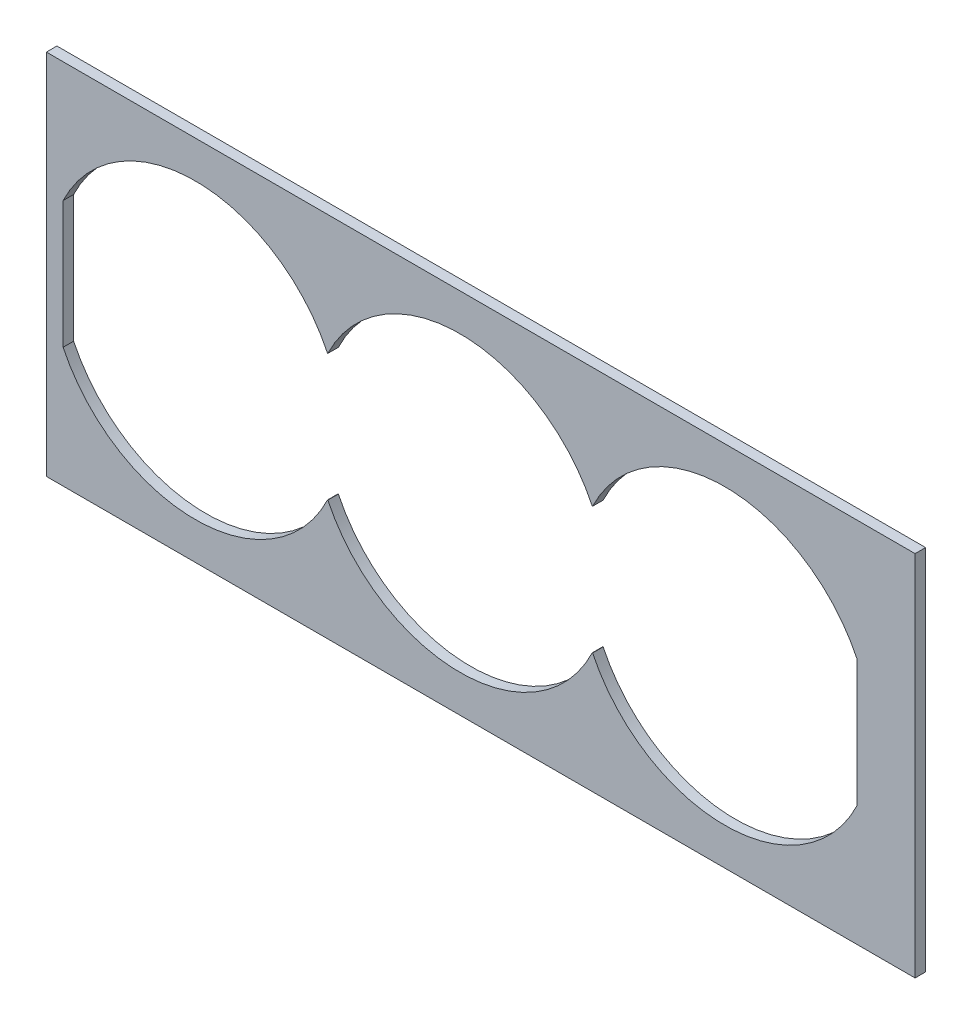
ISO-10303-21;
HEADER;
FILE_DESCRIPTION(('STEP AP214'),'2;1');
FILE_NAME('part.step','',(''),(''),'','','');
FILE_SCHEMA(('AUTOMOTIVE_DESIGN { 1 0 10303 214 1 1 1 1 }'));
ENDSEC;
DATA;
#1=APPLICATION_CONTEXT('core data for automotive mechanical design processes');
#2=APPLICATION_PROTOCOL_DEFINITION('international standard','automotive_design',2000,#1);
#3=PRODUCT_CONTEXT('',#1,'mechanical');
#4=PRODUCT('Part','Part','',(#3));
#5=PRODUCT_RELATED_PRODUCT_CATEGORY('part','',(#4));
#6=PRODUCT_DEFINITION_FORMATION('','',#4);
#7=PRODUCT_DEFINITION_CONTEXT('part definition',#1,'design');
#8=PRODUCT_DEFINITION('design','',#6,#7);
#9=PRODUCT_DEFINITION_SHAPE('','',#8);
#10=(LENGTH_UNIT() NAMED_UNIT(*) SI_UNIT(.MILLI.,.METRE.));
#11=(NAMED_UNIT(*) PLANE_ANGLE_UNIT() SI_UNIT($,.RADIAN.));
#12=(NAMED_UNIT(*) SI_UNIT($,.STERADIAN.) SOLID_ANGLE_UNIT());
#13=UNCERTAINTY_MEASURE_WITH_UNIT(LENGTH_MEASURE(1.E-05),#10,'distance_accuracy_value','');
#14=(GEOMETRIC_REPRESENTATION_CONTEXT(3) GLOBAL_UNCERTAINTY_ASSIGNED_CONTEXT((#13)) GLOBAL_UNIT_ASSIGNED_CONTEXT((#10,
#11,#12)) REPRESENTATION_CONTEXT('',''));
#15=CARTESIAN_POINT('',(0.,0.,0.));
#16=DIRECTION('',(0.,0.,1.));
#17=DIRECTION('',(1.,0.,0.));
#18=AXIS2_PLACEMENT_3D('',#15,#16,#17);
#19=CARTESIAN_POINT('',(0.,0.,4.));
#20=DIRECTION('',(0.,0.,-1.));
#21=DIRECTION('',(-1.,0.,0.));
#22=AXIS2_PLACEMENT_3D('',#19,#20,#21);
#23=PLANE('',#22);
#24=DIRECTION('',(0.,1.,0.));
#25=VECTOR('',#24,1.);
#26=CARTESIAN_POINT('',(330.2,0.,4.));
#27=LINE('',#26,#25);
#28=CARTESIAN_POINT('',(330.2,0.,4.));
#29=VERTEX_POINT('',#28);
#30=CARTESIAN_POINT('',(330.2,139.7,4.));
#31=VERTEX_POINT('',#30);
#32=EDGE_CURVE('E243',#29,#31,#27,.T.);
#33=ORIENTED_EDGE('',*,*,#32,.T.);
#34=DIRECTION('',(-1.,0.,0.));
#35=VECTOR('',#34,1.);
#36=CARTESIAN_POINT('',(0.,139.7,4.));
#37=LINE('',#36,#35);
#38=CARTESIAN_POINT('',(0.,139.7,4.));
#39=VERTEX_POINT('',#38);
#40=EDGE_CURVE('E246',#31,#39,#37,.T.);
#41=ORIENTED_EDGE('',*,*,#40,.T.);
#42=DIRECTION('',(0.,-1.,0.));
#43=VECTOR('',#42,1.);
#44=CARTESIAN_POINT('',(0.,0.,4.));
#45=LINE('',#44,#43);
#46=CARTESIAN_POINT('',(0.,0.,4.));
#47=VERTEX_POINT('',#46);
#48=EDGE_CURVE('E249',#39,#47,#45,.T.);
#49=ORIENTED_EDGE('',*,*,#48,.T.);
#50=DIRECTION('',(1.,0.,0.));
#51=VECTOR('',#50,1.);
#52=CARTESIAN_POINT('',(0.,0.,4.));
#53=LINE('',#52,#51);
#54=EDGE_CURVE('E251',#47,#29,#53,.T.);
#55=ORIENTED_EDGE('',*,*,#54,.T.);
#56=EDGE_LOOP('',(#33,#41,#49,#55));
#57=FACE_BOUND('',#56,.T.);
#58=CARTESIAN_POINT('',(56.604,69.8499999999999,4.));
#59=DIRECTION('',(0.,0.,1.));
#60=DIRECTION('',(1.,0.,0.));
#61=AXIS2_PLACEMENT_3D('',#58,#59,#60);
#62=CIRCLE('',#61,55.754);
#63=CARTESIAN_POINT('',(106.858,93.9963040650116,4.));
#64=VERTEX_POINT('',#63);
#65=CARTESIAN_POINT('',(6.35,93.9963040650116,4.));
#66=VERTEX_POINT('',#65);
#67=EDGE_CURVE('E150',#64,#66,#62,.T.);
#68=ORIENTED_EDGE('',*,*,#67,.F.);
#69=DIRECTION('',(-1.,0.,0.));
#70=VECTOR('',#69,1.);
#71=CARTESIAN_POINT('',(106.858,93.9963040650116,4.));
#72=LINE('',#71,#70);
#73=CARTESIAN_POINT('',(106.985,93.9963040650116,4.));
#74=VERTEX_POINT('',#73);
#75=EDGE_CURVE('E191',#74,#64,#72,.T.);
#76=ORIENTED_EDGE('',*,*,#75,.F.);
#77=CARTESIAN_POINT('',(157.239,69.8499999999999,4.));
#78=DIRECTION('',(0.,0.,1.));
#79=DIRECTION('',(1.,0.,0.));
#80=AXIS2_PLACEMENT_3D('',#77,#78,#79);
#81=CIRCLE('',#80,55.754);
#82=CARTESIAN_POINT('',(207.493,93.9963040650116,4.));
#83=VERTEX_POINT('',#82);
#84=EDGE_CURVE('E189',#83,#74,#81,.T.);
#85=ORIENTED_EDGE('',*,*,#84,.F.);
#86=DIRECTION('',(-1.,0.,0.));
#87=VECTOR('',#86,1.);
#88=CARTESIAN_POINT('',(207.493,93.9963040650116,4.));
#89=LINE('',#88,#87);
#90=CARTESIAN_POINT('',(207.62,93.9963040650116,4.));
#91=VERTEX_POINT('',#90);
#92=EDGE_CURVE('E187',#91,#83,#89,.T.);
#93=ORIENTED_EDGE('',*,*,#92,.F.);
#94=CARTESIAN_POINT('',(257.874,69.8499999999999,4.));
#95=DIRECTION('',(0.,0.,1.));
#96=DIRECTION('',(1.,0.,0.));
#97=AXIS2_PLACEMENT_3D('',#94,#95,#96);
#98=CIRCLE('',#97,55.754);
#99=CARTESIAN_POINT('',(308.128,93.9963040650116,4.));
#100=VERTEX_POINT('',#99);
#101=EDGE_CURVE('E185',#100,#91,#98,.T.);
#102=ORIENTED_EDGE('',*,*,#101,.F.);
#103=DIRECTION('',(0.,1.,0.));
#104=VECTOR('',#103,1.);
#105=CARTESIAN_POINT('',(308.128,93.9963040650116,4.));
#106=LINE('',#105,#104);
#107=CARTESIAN_POINT('',(308.128,45.7036959349883,4.));
#108=VERTEX_POINT('',#107);
#109=EDGE_CURVE('E183',#108,#100,#106,.T.);
#110=ORIENTED_EDGE('',*,*,#109,.F.);
#111=CARTESIAN_POINT('',(257.874,69.8499999999999,4.));
#112=DIRECTION('',(0.,0.,1.));
#113=DIRECTION('',(1.,0.,0.));
#114=AXIS2_PLACEMENT_3D('',#111,#112,#113);
#115=CIRCLE('',#114,55.754);
#116=CARTESIAN_POINT('',(207.62,45.7036959349884,4.));
#117=VERTEX_POINT('',#116);
#118=EDGE_CURVE('E181',#117,#108,#115,.T.);
#119=ORIENTED_EDGE('',*,*,#118,.F.);
#120=DIRECTION('',(1.,8.74191357973027E-13,0.));
#121=VECTOR('',#120,1.);
#122=CARTESIAN_POINT('',(207.62,45.7036959349884,4.));
#123=LINE('',#122,#121);
#124=CARTESIAN_POINT('',(207.493,45.7036959349883,4.));
#125=VERTEX_POINT('',#124);
#126=EDGE_CURVE('E179',#125,#117,#123,.T.);
#127=ORIENTED_EDGE('',*,*,#126,.F.);
#128=CARTESIAN_POINT('',(157.239,69.8499999999999,4.));
#129=DIRECTION('',(0.,0.,1.));
#130=DIRECTION('',(1.,0.,0.));
#131=AXIS2_PLACEMENT_3D('',#128,#129,#130);
#132=CIRCLE('',#131,55.754);
#133=CARTESIAN_POINT('',(106.985,45.7036959349884,4.));
#134=VERTEX_POINT('',#133);
#135=EDGE_CURVE('E177',#134,#125,#132,.T.);
#136=ORIENTED_EDGE('',*,*,#135,.F.);
#137=DIRECTION('',(1.,8.74191357973027E-13,0.));
#138=VECTOR('',#137,1.);
#139=CARTESIAN_POINT('',(106.985,45.7036959349884,4.));
#140=LINE('',#139,#138);
#141=CARTESIAN_POINT('',(106.858,45.7036959349883,4.));
#142=VERTEX_POINT('',#141);
#143=EDGE_CURVE('E173',#142,#134,#140,.T.);
#144=ORIENTED_EDGE('',*,*,#143,.F.);
#145=CARTESIAN_POINT('',(56.604,69.8499999999999,4.));
#146=DIRECTION('',(0.,0.,1.));
#147=DIRECTION('',(1.,0.,0.));
#148=AXIS2_PLACEMENT_3D('',#145,#146,#147);
#149=CIRCLE('',#148,55.754);
#150=CARTESIAN_POINT('',(6.35,45.7036959349884,4.));
#151=VERTEX_POINT('',#150);
#152=EDGE_CURVE('E171',#151,#142,#149,.T.);
#153=ORIENTED_EDGE('',*,*,#152,.F.);
#154=DIRECTION('',(0.,-1.,0.));
#155=VECTOR('',#154,1.);
#156=CARTESIAN_POINT('',(6.35,93.9963040650116,4.));
#157=LINE('',#156,#155);
#158=EDGE_CURVE('E158',#66,#151,#157,.T.);
#159=ORIENTED_EDGE('',*,*,#158,.F.);
#160=EDGE_LOOP('',(#68,#76,#85,#93,#102,#110,#119,#127,#136,#144,#153,#159));
#161=FACE_BOUND('',#160,.T.);
#162=ADVANCED_FACE('F37',(#57,#161),#23,.F.);
#163=CARTESIAN_POINT('',(0.,0.,0.));
#164=DIRECTION('',(0.,0.,-1.));
#165=DIRECTION('',(-1.,0.,0.));
#166=AXIS2_PLACEMENT_3D('',#163,#164,#165);
#167=PLANE('',#166);
#168=DIRECTION('',(0.,1.,0.));
#169=VECTOR('',#168,1.);
#170=CARTESIAN_POINT('',(330.2,0.,0.));
#171=LINE('',#170,#169);
#172=CARTESIAN_POINT('',(330.2,0.,0.));
#173=VERTEX_POINT('',#172);
#174=CARTESIAN_POINT('',(330.2,139.7,0.));
#175=VERTEX_POINT('',#174);
#176=EDGE_CURVE('E166',#173,#175,#171,.T.);
#177=ORIENTED_EDGE('',*,*,#176,.F.);
#178=DIRECTION('',(1.,0.,0.));
#179=VECTOR('',#178,1.);
#180=CARTESIAN_POINT('',(0.,0.,0.));
#181=LINE('',#180,#179);
#182=CARTESIAN_POINT('',(0.,0.,0.));
#183=VERTEX_POINT('',#182);
#184=EDGE_CURVE('E247',#183,#173,#181,.T.);
#185=ORIENTED_EDGE('',*,*,#184,.F.);
#186=DIRECTION('',(0.,-1.,0.));
#187=VECTOR('',#186,1.);
#188=CARTESIAN_POINT('',(0.,0.,0.));
#189=LINE('',#188,#187);
#190=CARTESIAN_POINT('',(0.,139.7,0.));
#191=VERTEX_POINT('',#190);
#192=EDGE_CURVE('E258',#191,#183,#189,.T.);
#193=ORIENTED_EDGE('',*,*,#192,.F.);
#194=DIRECTION('',(-1.,0.,0.));
#195=VECTOR('',#194,1.);
#196=CARTESIAN_POINT('',(0.,139.7,0.));
#197=LINE('',#196,#195);
#198=EDGE_CURVE('E256',#175,#191,#197,.T.);
#199=ORIENTED_EDGE('',*,*,#198,.F.);
#200=EDGE_LOOP('',(#177,#185,#193,#199));
#201=FACE_BOUND('',#200,.T.);
#202=DIRECTION('',(-1.,0.,0.));
#203=VECTOR('',#202,1.);
#204=CARTESIAN_POINT('',(106.858,93.9963040650116,0.));
#205=LINE('',#204,#203);
#206=CARTESIAN_POINT('',(106.985,93.9963040650116,0.));
#207=VERTEX_POINT('',#206);
#208=CARTESIAN_POINT('',(106.858,93.9963040650116,0.));
#209=VERTEX_POINT('',#208);
#210=EDGE_CURVE('E159',#207,#209,#205,.T.);
#211=ORIENTED_EDGE('',*,*,#210,.T.);
#212=CARTESIAN_POINT('',(56.604,69.8499999999999,0.));
#213=DIRECTION('',(0.,0.,1.));
#214=DIRECTION('',(1.,0.,0.));
#215=AXIS2_PLACEMENT_3D('',#212,#213,#214);
#216=CIRCLE('',#215,55.754);
#217=CARTESIAN_POINT('',(6.35,93.9963040650116,0.));
#218=VERTEX_POINT('',#217);
#219=EDGE_CURVE('E60',#209,#218,#216,.T.);
#220=ORIENTED_EDGE('',*,*,#219,.T.);
#221=DIRECTION('',(0.,-1.,0.));
#222=VECTOR('',#221,1.);
#223=CARTESIAN_POINT('',(6.35,93.9963040650116,0.));
#224=LINE('',#223,#222);
#225=CARTESIAN_POINT('',(6.35,45.7036959349884,0.));
#226=VERTEX_POINT('',#225);
#227=EDGE_CURVE('E165',#218,#226,#224,.T.);
#228=ORIENTED_EDGE('',*,*,#227,.T.);
#229=CARTESIAN_POINT('',(56.604,69.8499999999999,0.));
#230=DIRECTION('',(0.,0.,1.));
#231=DIRECTION('',(1.,0.,0.));
#232=AXIS2_PLACEMENT_3D('',#229,#230,#231);
#233=CIRCLE('',#232,55.754);
#234=CARTESIAN_POINT('',(106.858,45.7036959349883,0.));
#235=VERTEX_POINT('',#234);
#236=EDGE_CURVE('E195',#226,#235,#233,.T.);
#237=ORIENTED_EDGE('',*,*,#236,.T.);
#238=DIRECTION('',(1.,8.74191357973027E-13,0.));
#239=VECTOR('',#238,1.);
#240=CARTESIAN_POINT('',(106.985,45.7036959349884,0.));
#241=LINE('',#240,#239);
#242=CARTESIAN_POINT('',(106.985,45.7036959349884,0.));
#243=VERTEX_POINT('',#242);
#244=EDGE_CURVE('E198',#235,#243,#241,.T.);
#245=ORIENTED_EDGE('',*,*,#244,.T.);
#246=CARTESIAN_POINT('',(157.239,69.8499999999999,0.));
#247=DIRECTION('',(0.,0.,1.));
#248=DIRECTION('',(1.,0.,0.));
#249=AXIS2_PLACEMENT_3D('',#246,#247,#248);
#250=CIRCLE('',#249,55.754);
#251=CARTESIAN_POINT('',(207.493,45.7036959349883,0.));
#252=VERTEX_POINT('',#251);
#253=EDGE_CURVE('E201',#243,#252,#250,.T.);
#254=ORIENTED_EDGE('',*,*,#253,.T.);
#255=DIRECTION('',(1.,8.74191357973027E-13,0.));
#256=VECTOR('',#255,1.);
#257=CARTESIAN_POINT('',(207.62,45.7036959349884,0.));
#258=LINE('',#257,#256);
#259=CARTESIAN_POINT('',(207.62,45.7036959349884,0.));
#260=VERTEX_POINT('',#259);
#261=EDGE_CURVE('E204',#252,#260,#258,.T.);
#262=ORIENTED_EDGE('',*,*,#261,.T.);
#263=CARTESIAN_POINT('',(257.874,69.8499999999999,0.));
#264=DIRECTION('',(0.,0.,1.));
#265=DIRECTION('',(1.,0.,0.));
#266=AXIS2_PLACEMENT_3D('',#263,#264,#265);
#267=CIRCLE('',#266,55.754);
#268=CARTESIAN_POINT('',(308.128,45.7036959349883,0.));
#269=VERTEX_POINT('',#268);
#270=EDGE_CURVE('E207',#260,#269,#267,.T.);
#271=ORIENTED_EDGE('',*,*,#270,.T.);
#272=DIRECTION('',(0.,1.,0.));
#273=VECTOR('',#272,1.);
#274=CARTESIAN_POINT('',(308.128,93.9963040650116,0.));
#275=LINE('',#274,#273);
#276=CARTESIAN_POINT('',(308.128,93.9963040650116,0.));
#277=VERTEX_POINT('',#276);
#278=EDGE_CURVE('E210',#269,#277,#275,.T.);
#279=ORIENTED_EDGE('',*,*,#278,.T.);
#280=CARTESIAN_POINT('',(257.874,69.8499999999999,0.));
#281=DIRECTION('',(0.,0.,1.));
#282=DIRECTION('',(1.,0.,0.));
#283=AXIS2_PLACEMENT_3D('',#280,#281,#282);
#284=CIRCLE('',#283,55.754);
#285=CARTESIAN_POINT('',(207.62,93.9963040650116,0.));
#286=VERTEX_POINT('',#285);
#287=EDGE_CURVE('E213',#277,#286,#284,.T.);
#288=ORIENTED_EDGE('',*,*,#287,.T.);
#289=DIRECTION('',(-1.,0.,0.));
#290=VECTOR('',#289,1.);
#291=CARTESIAN_POINT('',(207.493,93.9963040650116,0.));
#292=LINE('',#291,#290);
#293=CARTESIAN_POINT('',(207.493,93.9963040650116,0.));
#294=VERTEX_POINT('',#293);
#295=EDGE_CURVE('E216',#286,#294,#292,.T.);
#296=ORIENTED_EDGE('',*,*,#295,.T.);
#297=CARTESIAN_POINT('',(157.239,69.8499999999999,0.));
#298=DIRECTION('',(0.,0.,1.));
#299=DIRECTION('',(1.,0.,0.));
#300=AXIS2_PLACEMENT_3D('',#297,#298,#299);
#301=CIRCLE('',#300,55.754);
#302=EDGE_CURVE('E219',#294,#207,#301,.T.);
#303=ORIENTED_EDGE('',*,*,#302,.T.);
#304=EDGE_LOOP('',(#211,#220,#228,#237,#245,#254,#262,#271,#279,#288,#296,#303));
#305=FACE_BOUND('',#304,.T.);
#306=ADVANCED_FACE('F276',(#201,#305),#167,.T.);
#307=CARTESIAN_POINT('',(330.2,0.,4.));
#308=DIRECTION('',(-1.,0.,0.));
#309=DIRECTION('',(0.,0.,1.));
#310=AXIS2_PLACEMENT_3D('',#307,#308,#309);
#311=PLANE('',#310);
#312=ORIENTED_EDGE('',*,*,#176,.T.);
#313=DIRECTION('',(0.,0.,-1.));
#314=VECTOR('',#313,1.);
#315=CARTESIAN_POINT('',(330.2,139.7,4.));
#316=LINE('',#315,#314);
#317=EDGE_CURVE('E11',#31,#175,#316,.T.);
#318=ORIENTED_EDGE('',*,*,#317,.F.);
#319=ORIENTED_EDGE('',*,*,#32,.F.);
#320=DIRECTION('',(0.,0.,-1.));
#321=VECTOR('',#320,1.);
#322=CARTESIAN_POINT('',(330.2,0.,4.));
#323=LINE('',#322,#321);
#324=EDGE_CURVE('E253',#29,#173,#323,.T.);
#325=ORIENTED_EDGE('',*,*,#324,.T.);
#326=EDGE_LOOP('',(#312,#318,#319,#325));
#327=FACE_BOUND('',#326,.T.);
#328=ADVANCED_FACE('F39',(#327),#311,.F.);
#329=CARTESIAN_POINT('',(0.,139.7,4.));
#330=DIRECTION('',(0.,-1.,0.));
#331=DIRECTION('',(0.,0.,-1.));
#332=AXIS2_PLACEMENT_3D('',#329,#330,#331);
#333=PLANE('',#332);
#334=ORIENTED_EDGE('',*,*,#198,.T.);
#335=DIRECTION('',(0.,0.,-1.));
#336=VECTOR('',#335,1.);
#337=CARTESIAN_POINT('',(0.,139.7,4.));
#338=LINE('',#337,#336);
#339=EDGE_CURVE('E45',#39,#191,#338,.T.);
#340=ORIENTED_EDGE('',*,*,#339,.F.);
#341=ORIENTED_EDGE('',*,*,#40,.F.);
#342=ORIENTED_EDGE('',*,*,#317,.T.);
#343=EDGE_LOOP('',(#334,#340,#341,#342));
#344=FACE_BOUND('',#343,.T.);
#345=ADVANCED_FACE('F286',(#344),#333,.F.);
#346=CARTESIAN_POINT('',(0.,0.,4.));
#347=DIRECTION('',(1.,0.,0.));
#348=DIRECTION('',(0.,1.,0.));
#349=AXIS2_PLACEMENT_3D('',#346,#347,#348);
#350=PLANE('',#349);
#351=ORIENTED_EDGE('',*,*,#192,.T.);
#352=DIRECTION('',(0.,0.,-1.));
#353=VECTOR('',#352,1.);
#354=CARTESIAN_POINT('',(0.,0.,4.));
#355=LINE('',#354,#353);
#356=EDGE_CURVE('E263',#47,#183,#355,.T.);
#357=ORIENTED_EDGE('',*,*,#356,.F.);
#358=ORIENTED_EDGE('',*,*,#48,.F.);
#359=ORIENTED_EDGE('',*,*,#339,.T.);
#360=EDGE_LOOP('',(#351,#357,#358,#359));
#361=FACE_BOUND('',#360,.T.);
#362=ADVANCED_FACE('F270',(#361),#350,.F.);
#363=CARTESIAN_POINT('',(0.,0.,4.));
#364=DIRECTION('',(0.,1.,0.));
#365=DIRECTION('',(0.,0.,1.));
#366=AXIS2_PLACEMENT_3D('',#363,#364,#365);
#367=PLANE('',#366);
#368=ORIENTED_EDGE('',*,*,#184,.T.);
#369=ORIENTED_EDGE('',*,*,#324,.F.);
#370=ORIENTED_EDGE('',*,*,#54,.F.);
#371=ORIENTED_EDGE('',*,*,#356,.T.);
#372=EDGE_LOOP('',(#368,#369,#370,#371));
#373=FACE_BOUND('',#372,.T.);
#374=ADVANCED_FACE('F280',(#373),#367,.F.);
#375=CARTESIAN_POINT('',(56.604,69.8499999999999,4.));
#376=DIRECTION('',(0.,0.,-1.));
#377=DIRECTION('',(-1.,0.,0.));
#378=AXIS2_PLACEMENT_3D('',#375,#376,#377);
#379=CYLINDRICAL_SURFACE('',#378,55.754);
#380=ORIENTED_EDGE('',*,*,#219,.F.);
#381=DIRECTION('',(0.,0.,-1.));
#382=VECTOR('',#381,1.);
#383=CARTESIAN_POINT('',(106.858,93.9963040650116,4.));
#384=LINE('',#383,#382);
#385=EDGE_CURVE('E154',#64,#209,#384,.T.);
#386=ORIENTED_EDGE('',*,*,#385,.F.);
#387=ORIENTED_EDGE('',*,*,#67,.T.);
#388=DIRECTION('',(0.,0.,-1.));
#389=VECTOR('',#388,1.);
#390=CARTESIAN_POINT('',(6.35,93.9963040650116,4.));
#391=LINE('',#390,#389);
#392=EDGE_CURVE('E153',#66,#218,#391,.T.);
#393=ORIENTED_EDGE('',*,*,#392,.T.);
#394=EDGE_LOOP('',(#380,#386,#387,#393));
#395=FACE_BOUND('',#394,.T.);
#396=ADVANCED_FACE('F152',(#395),#379,.F.);
#397=CARTESIAN_POINT('',(6.35,93.9963040650116,4.));
#398=DIRECTION('',(1.,0.,0.));
#399=DIRECTION('',(0.,0.,-1.));
#400=AXIS2_PLACEMENT_3D('',#397,#398,#399);
#401=PLANE('',#400);
#402=ORIENTED_EDGE('',*,*,#227,.F.);
#403=ORIENTED_EDGE('',*,*,#392,.F.);
#404=ORIENTED_EDGE('',*,*,#158,.T.);
#405=DIRECTION('',(0.,0.,-1.));
#406=VECTOR('',#405,1.);
#407=CARTESIAN_POINT('',(6.35,45.7036959349884,4.));
#408=LINE('',#407,#406);
#409=EDGE_CURVE('E167',#151,#226,#408,.T.);
#410=ORIENTED_EDGE('',*,*,#409,.T.);
#411=EDGE_LOOP('',(#402,#403,#404,#410));
#412=FACE_BOUND('',#411,.T.);
#413=ADVANCED_FACE('F162',(#412),#401,.T.);
#414=CARTESIAN_POINT('',(56.604,69.8499999999999,4.));
#415=DIRECTION('',(0.,0.,-1.));
#416=DIRECTION('',(-1.,0.,0.));
#417=AXIS2_PLACEMENT_3D('',#414,#415,#416);
#418=CYLINDRICAL_SURFACE('',#417,55.754);
#419=ORIENTED_EDGE('',*,*,#236,.F.);
#420=ORIENTED_EDGE('',*,*,#409,.F.);
#421=ORIENTED_EDGE('',*,*,#152,.T.);
#422=DIRECTION('',(0.,0.,-1.));
#423=VECTOR('',#422,1.);
#424=CARTESIAN_POINT('',(106.858,45.7036959349883,4.));
#425=LINE('',#424,#423);
#426=EDGE_CURVE('E240',#142,#235,#425,.T.);
#427=ORIENTED_EDGE('',*,*,#426,.T.);
#428=EDGE_LOOP('',(#419,#420,#421,#427));
#429=FACE_BOUND('',#428,.T.);
#430=ADVANCED_FACE('F309',(#429),#418,.F.);
#431=CARTESIAN_POINT('',(106.985,45.7036959349884,4.));
#432=DIRECTION('',(-8.74191357973027E-13,1.,0.));
#433=DIRECTION('',(-1.,-8.74191357973027E-13,0.));
#434=AXIS2_PLACEMENT_3D('',#431,#432,#433);
#435=PLANE('',#434);
#436=ORIENTED_EDGE('',*,*,#244,.F.);
#437=ORIENTED_EDGE('',*,*,#426,.F.);
#438=ORIENTED_EDGE('',*,*,#143,.T.);
#439=DIRECTION('',(0.,0.,-1.));
#440=VECTOR('',#439,1.);
#441=CARTESIAN_POINT('',(106.985,45.7036959349884,4.));
#442=LINE('',#441,#440);
#443=EDGE_CURVE('E238',#134,#243,#442,.T.);
#444=ORIENTED_EDGE('',*,*,#443,.T.);
#445=EDGE_LOOP('',(#436,#437,#438,#444));
#446=FACE_BOUND('',#445,.T.);
#447=ADVANCED_FACE('F313',(#446),#435,.T.);
#448=CARTESIAN_POINT('',(157.239,69.8499999999999,4.));
#449=DIRECTION('',(0.,0.,-1.));
#450=DIRECTION('',(-1.,0.,0.));
#451=AXIS2_PLACEMENT_3D('',#448,#449,#450);
#452=CYLINDRICAL_SURFACE('',#451,55.754);
#453=ORIENTED_EDGE('',*,*,#253,.F.);
#454=ORIENTED_EDGE('',*,*,#443,.F.);
#455=ORIENTED_EDGE('',*,*,#135,.T.);
#456=DIRECTION('',(0.,0.,-1.));
#457=VECTOR('',#456,1.);
#458=CARTESIAN_POINT('',(207.493,45.7036959349883,4.));
#459=LINE('',#458,#457);
#460=EDGE_CURVE('E236',#125,#252,#459,.T.);
#461=ORIENTED_EDGE('',*,*,#460,.T.);
#462=EDGE_LOOP('',(#453,#454,#455,#461));
#463=FACE_BOUND('',#462,.T.);
#464=ADVANCED_FACE('F319',(#463),#452,.F.);
#465=CARTESIAN_POINT('',(207.62,45.7036959349884,4.));
#466=DIRECTION('',(-8.74191357973027E-13,1.,0.));
#467=DIRECTION('',(-1.,-8.74191357973027E-13,0.));
#468=AXIS2_PLACEMENT_3D('',#465,#466,#467);
#469=PLANE('',#468);
#470=ORIENTED_EDGE('',*,*,#261,.F.);
#471=ORIENTED_EDGE('',*,*,#460,.F.);
#472=ORIENTED_EDGE('',*,*,#126,.T.);
#473=DIRECTION('',(0.,0.,-1.));
#474=VECTOR('',#473,1.);
#475=CARTESIAN_POINT('',(207.62,45.7036959349884,4.));
#476=LINE('',#475,#474);
#477=EDGE_CURVE('E234',#117,#260,#476,.T.);
#478=ORIENTED_EDGE('',*,*,#477,.T.);
#479=EDGE_LOOP('',(#470,#471,#472,#478));
#480=FACE_BOUND('',#479,.T.);
#481=ADVANCED_FACE('F323',(#480),#469,.T.);
#482=CARTESIAN_POINT('',(257.874,69.8499999999999,4.));
#483=DIRECTION('',(0.,0.,-1.));
#484=DIRECTION('',(-1.,0.,0.));
#485=AXIS2_PLACEMENT_3D('',#482,#483,#484);
#486=CYLINDRICAL_SURFACE('',#485,55.754);
#487=ORIENTED_EDGE('',*,*,#270,.F.);
#488=ORIENTED_EDGE('',*,*,#477,.F.);
#489=ORIENTED_EDGE('',*,*,#118,.T.);
#490=DIRECTION('',(0.,0.,-1.));
#491=VECTOR('',#490,1.);
#492=CARTESIAN_POINT('',(308.128,45.7036959349883,4.));
#493=LINE('',#492,#491);
#494=EDGE_CURVE('E232',#108,#269,#493,.T.);
#495=ORIENTED_EDGE('',*,*,#494,.T.);
#496=EDGE_LOOP('',(#487,#488,#489,#495));
#497=FACE_BOUND('',#496,.T.);
#498=ADVANCED_FACE('F327',(#497),#486,.F.);
#499=CARTESIAN_POINT('',(308.128,93.9963040650116,4.));
#500=DIRECTION('',(-1.,0.,0.));
#501=DIRECTION('',(0.,0.,1.));
#502=AXIS2_PLACEMENT_3D('',#499,#500,#501);
#503=PLANE('',#502);
#504=ORIENTED_EDGE('',*,*,#278,.F.);
#505=ORIENTED_EDGE('',*,*,#494,.F.);
#506=ORIENTED_EDGE('',*,*,#109,.T.);
#507=DIRECTION('',(0.,0.,-1.));
#508=VECTOR('',#507,1.);
#509=CARTESIAN_POINT('',(308.128,93.9963040650116,4.));
#510=LINE('',#509,#508);
#511=EDGE_CURVE('E230',#100,#277,#510,.T.);
#512=ORIENTED_EDGE('',*,*,#511,.T.);
#513=EDGE_LOOP('',(#504,#505,#506,#512));
#514=FACE_BOUND('',#513,.T.);
#515=ADVANCED_FACE('F331',(#514),#503,.T.);
#516=CARTESIAN_POINT('',(257.874,69.8499999999999,4.));
#517=DIRECTION('',(0.,0.,-1.));
#518=DIRECTION('',(-1.,0.,0.));
#519=AXIS2_PLACEMENT_3D('',#516,#517,#518);
#520=CYLINDRICAL_SURFACE('',#519,55.754);
#521=ORIENTED_EDGE('',*,*,#287,.F.);
#522=ORIENTED_EDGE('',*,*,#511,.F.);
#523=ORIENTED_EDGE('',*,*,#101,.T.);
#524=DIRECTION('',(0.,0.,-1.));
#525=VECTOR('',#524,1.);
#526=CARTESIAN_POINT('',(207.62,93.9963040650116,4.));
#527=LINE('',#526,#525);
#528=EDGE_CURVE('E228',#91,#286,#527,.T.);
#529=ORIENTED_EDGE('',*,*,#528,.T.);
#530=EDGE_LOOP('',(#521,#522,#523,#529));
#531=FACE_BOUND('',#530,.T.);
#532=ADVANCED_FACE('F335',(#531),#520,.F.);
#533=CARTESIAN_POINT('',(207.493,93.9963040650116,4.));
#534=DIRECTION('',(0.,-1.,0.));
#535=DIRECTION('',(0.,0.,-1.));
#536=AXIS2_PLACEMENT_3D('',#533,#534,#535);
#537=PLANE('',#536);
#538=ORIENTED_EDGE('',*,*,#295,.F.);
#539=ORIENTED_EDGE('',*,*,#528,.F.);
#540=ORIENTED_EDGE('',*,*,#92,.T.);
#541=DIRECTION('',(0.,0.,-1.));
#542=VECTOR('',#541,1.);
#543=CARTESIAN_POINT('',(207.493,93.9963040650116,4.));
#544=LINE('',#543,#542);
#545=EDGE_CURVE('E226',#83,#294,#544,.T.);
#546=ORIENTED_EDGE('',*,*,#545,.T.);
#547=EDGE_LOOP('',(#538,#539,#540,#546));
#548=FACE_BOUND('',#547,.T.);
#549=ADVANCED_FACE('F339',(#548),#537,.T.);
#550=CARTESIAN_POINT('',(157.239,69.8499999999999,4.));
#551=DIRECTION('',(0.,0.,-1.));
#552=DIRECTION('',(-1.,0.,0.));
#553=AXIS2_PLACEMENT_3D('',#550,#551,#552);
#554=CYLINDRICAL_SURFACE('',#553,55.754);
#555=ORIENTED_EDGE('',*,*,#302,.F.);
#556=ORIENTED_EDGE('',*,*,#545,.F.);
#557=ORIENTED_EDGE('',*,*,#84,.T.);
#558=DIRECTION('',(0.,0.,-1.));
#559=VECTOR('',#558,1.);
#560=CARTESIAN_POINT('',(106.985,93.9963040650116,4.));
#561=LINE('',#560,#559);
#562=EDGE_CURVE('E52',#74,#207,#561,.T.);
#563=ORIENTED_EDGE('',*,*,#562,.T.);
#564=EDGE_LOOP('',(#555,#556,#557,#563));
#565=FACE_BOUND('',#564,.T.);
#566=ADVANCED_FACE('F343',(#565),#554,.F.);
#567=CARTESIAN_POINT('',(106.858,93.9963040650116,4.));
#568=DIRECTION('',(0.,-1.,0.));
#569=DIRECTION('',(0.,0.,-1.));
#570=AXIS2_PLACEMENT_3D('',#567,#568,#569);
#571=PLANE('',#570);
#572=ORIENTED_EDGE('',*,*,#210,.F.);
#573=ORIENTED_EDGE('',*,*,#562,.F.);
#574=ORIENTED_EDGE('',*,*,#75,.T.);
#575=ORIENTED_EDGE('',*,*,#385,.T.);
#576=EDGE_LOOP('',(#572,#573,#574,#575));
#577=FACE_BOUND('',#576,.T.);
#578=ADVANCED_FACE('F347',(#577),#571,.T.);
#579=CLOSED_SHELL('',(#162,#306,#328,#345,#362,#374,#396,#413,#430,#447,#464,#481,#498,#515,
#532,#549,#566,#578));
#580=MANIFOLD_SOLID_BREP('B2',#579);
#581=ADVANCED_BREP_SHAPE_REPRESENTATION('',(#18,#580),#14);
#582=SHAPE_DEFINITION_REPRESENTATION(#9,#581);
ENDSEC;
END-ISO-10303-21;
